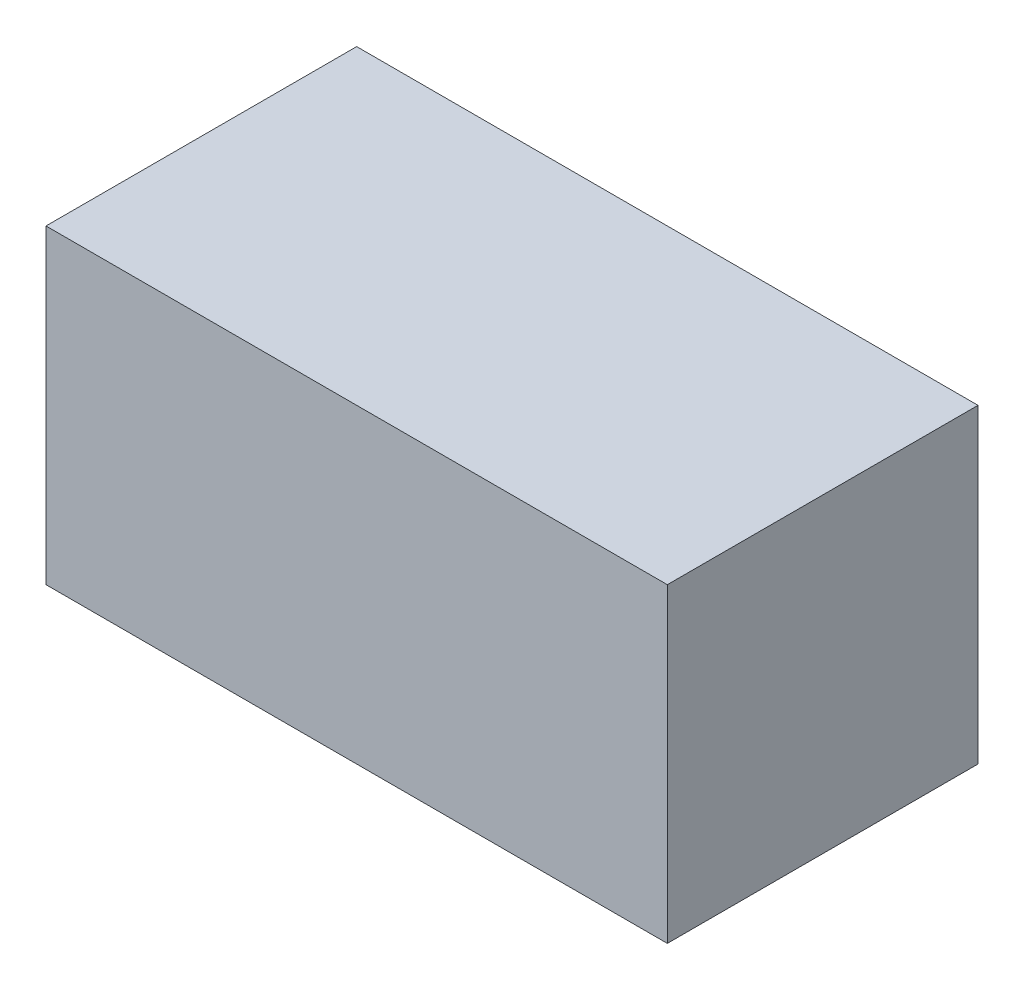
ISO-10303-21;
HEADER;
FILE_DESCRIPTION(('STEP AP214'),'2;1');
FILE_NAME('part.step','',(''),(''),'','','');
FILE_SCHEMA(('AUTOMOTIVE_DESIGN { 1 0 10303 214 1 1 1 1 }'));
ENDSEC;
DATA;
#1=APPLICATION_CONTEXT('core data for automotive mechanical design processes');
#2=APPLICATION_PROTOCOL_DEFINITION('international standard','automotive_design',2000,#1);
#3=PRODUCT_CONTEXT('',#1,'mechanical');
#4=PRODUCT('Part','Part','',(#3));
#5=PRODUCT_RELATED_PRODUCT_CATEGORY('part','',(#4));
#6=PRODUCT_DEFINITION_FORMATION('','',#4);
#7=PRODUCT_DEFINITION_CONTEXT('part definition',#1,'design');
#8=PRODUCT_DEFINITION('design','',#6,#7);
#9=PRODUCT_DEFINITION_SHAPE('','',#8);
#10=(LENGTH_UNIT() NAMED_UNIT(*) SI_UNIT(.MILLI.,.METRE.));
#11=(NAMED_UNIT(*) PLANE_ANGLE_UNIT() SI_UNIT($,.RADIAN.));
#12=(NAMED_UNIT(*) SI_UNIT($,.STERADIAN.) SOLID_ANGLE_UNIT());
#13=UNCERTAINTY_MEASURE_WITH_UNIT(LENGTH_MEASURE(1.E-05),#10,'distance_accuracy_value','');
#14=(GEOMETRIC_REPRESENTATION_CONTEXT(3) GLOBAL_UNCERTAINTY_ASSIGNED_CONTEXT((#13)) GLOBAL_UNIT_ASSIGNED_CONTEXT((#10,
#11,#12)) REPRESENTATION_CONTEXT('',''));
#15=CARTESIAN_POINT('',(0.,0.,0.));
#16=DIRECTION('',(0.,0.,1.));
#17=DIRECTION('',(1.,0.,0.));
#18=AXIS2_PLACEMENT_3D('',#15,#16,#17);
#19=CARTESIAN_POINT('',(25.,25.,12.5));
#20=DIRECTION('',(-1.,0.,0.));
#21=DIRECTION('',(0.,0.,1.));
#22=AXIS2_PLACEMENT_3D('',#19,#20,#21);
#23=PLANE('',#22);
#24=DIRECTION('',(0.,0.,-1.));
#25=VECTOR('',#24,1.);
#26=CARTESIAN_POINT('',(25.,0.,12.5));
#27=LINE('',#26,#25);
#28=CARTESIAN_POINT('',(25.,0.,12.5));
#29=VERTEX_POINT('',#28);
#30=CARTESIAN_POINT('',(25.,0.,-12.5));
#31=VERTEX_POINT('',#30);
#32=EDGE_CURVE('E105',#29,#31,#27,.T.);
#33=ORIENTED_EDGE('',*,*,#32,.T.);
#34=DIRECTION('',(0.,-1.,0.));
#35=VECTOR('',#34,1.);
#36=CARTESIAN_POINT('',(25.,25.,-12.5));
#37=LINE('',#36,#35);
#38=CARTESIAN_POINT('',(25.,25.,-12.5));
#39=VERTEX_POINT('',#38);
#40=EDGE_CURVE('E11',#39,#31,#37,.T.);
#41=ORIENTED_EDGE('',*,*,#40,.F.);
#42=DIRECTION('',(0.,0.,-1.));
#43=VECTOR('',#42,1.);
#44=CARTESIAN_POINT('',(25.,25.,12.5));
#45=LINE('',#44,#43);
#46=CARTESIAN_POINT('',(25.,25.,12.5));
#47=VERTEX_POINT('',#46);
#48=EDGE_CURVE('E89',#47,#39,#45,.T.);
#49=ORIENTED_EDGE('',*,*,#48,.F.);
#50=DIRECTION('',(0.,-1.,0.));
#51=VECTOR('',#50,1.);
#52=CARTESIAN_POINT('',(25.,25.,12.5));
#53=LINE('',#52,#51);
#54=EDGE_CURVE('E97',#47,#29,#53,.T.);
#55=ORIENTED_EDGE('',*,*,#54,.T.);
#56=EDGE_LOOP('',(#33,#41,#49,#55));
#57=FACE_BOUND('',#56,.T.);
#58=ADVANCED_FACE('F39',(#57),#23,.F.);
#59=CARTESIAN_POINT('',(-25.,25.,-12.5));
#60=DIRECTION('',(0.,0.,1.));
#61=DIRECTION('',(1.,0.,0.));
#62=AXIS2_PLACEMENT_3D('',#59,#60,#61);
#63=PLANE('',#62);
#64=DIRECTION('',(-1.,0.,0.));
#65=VECTOR('',#64,1.);
#66=CARTESIAN_POINT('',(-25.,0.,-12.5));
#67=LINE('',#66,#65);
#68=CARTESIAN_POINT('',(-25.,0.,-12.5));
#69=VERTEX_POINT('',#68);
#70=EDGE_CURVE('E92',#31,#69,#67,.T.);
#71=ORIENTED_EDGE('',*,*,#70,.T.);
#72=DIRECTION('',(0.,-1.,0.));
#73=VECTOR('',#72,1.);
#74=CARTESIAN_POINT('',(-25.,25.,-12.5));
#75=LINE('',#74,#73);
#76=CARTESIAN_POINT('',(-25.,25.,-12.5));
#77=VERTEX_POINT('',#76);
#78=EDGE_CURVE('E50',#77,#69,#75,.T.);
#79=ORIENTED_EDGE('',*,*,#78,.F.);
#80=DIRECTION('',(-1.,0.,0.));
#81=VECTOR('',#80,1.);
#82=CARTESIAN_POINT('',(-25.,25.,-12.5));
#83=LINE('',#82,#81);
#84=EDGE_CURVE('E82',#39,#77,#83,.T.);
#85=ORIENTED_EDGE('',*,*,#84,.F.);
#86=ORIENTED_EDGE('',*,*,#40,.T.);
#87=EDGE_LOOP('',(#71,#79,#85,#86));
#88=FACE_BOUND('',#87,.T.);
#89=ADVANCED_FACE('F93',(#88),#63,.F.);
#90=CARTESIAN_POINT('',(-25.,25.,12.5));
#91=DIRECTION('',(1.,0.,0.));
#92=DIRECTION('',(0.,0.,-1.));
#93=AXIS2_PLACEMENT_3D('',#90,#91,#92);
#94=PLANE('',#93);
#95=DIRECTION('',(0.,0.,1.));
#96=VECTOR('',#95,1.);
#97=CARTESIAN_POINT('',(-25.,0.,12.5));
#98=LINE('',#97,#96);
#99=CARTESIAN_POINT('',(-25.,0.,12.5));
#100=VERTEX_POINT('',#99);
#101=EDGE_CURVE('E72',#69,#100,#98,.T.);
#102=ORIENTED_EDGE('',*,*,#101,.T.);
#103=DIRECTION('',(0.,-1.,0.));
#104=VECTOR('',#103,1.);
#105=CARTESIAN_POINT('',(-25.,25.,12.5));
#106=LINE('',#105,#104);
#107=CARTESIAN_POINT('',(-25.,25.,12.5));
#108=VERTEX_POINT('',#107);
#109=EDGE_CURVE('E94',#108,#100,#106,.T.);
#110=ORIENTED_EDGE('',*,*,#109,.F.);
#111=DIRECTION('',(0.,0.,1.));
#112=VECTOR('',#111,1.);
#113=CARTESIAN_POINT('',(-25.,25.,12.5));
#114=LINE('',#113,#112);
#115=EDGE_CURVE('E88',#77,#108,#114,.T.);
#116=ORIENTED_EDGE('',*,*,#115,.F.);
#117=ORIENTED_EDGE('',*,*,#78,.T.);
#118=EDGE_LOOP('',(#102,#110,#116,#117));
#119=FACE_BOUND('',#118,.T.);
#120=ADVANCED_FACE('F96',(#119),#94,.F.);
#121=CARTESIAN_POINT('',(-25.,25.,12.5));
#122=DIRECTION('',(0.,0.,-1.));
#123=DIRECTION('',(-1.,0.,0.));
#124=AXIS2_PLACEMENT_3D('',#121,#122,#123);
#125=PLANE('',#124);
#126=DIRECTION('',(1.,0.,0.));
#127=VECTOR('',#126,1.);
#128=CARTESIAN_POINT('',(-25.,0.,12.5));
#129=LINE('',#128,#127);
#130=EDGE_CURVE('E76',#100,#29,#129,.T.);
#131=ORIENTED_EDGE('',*,*,#130,.T.);
#132=ORIENTED_EDGE('',*,*,#54,.F.);
#133=DIRECTION('',(1.,0.,0.));
#134=VECTOR('',#133,1.);
#135=CARTESIAN_POINT('',(-25.,25.,12.5));
#136=LINE('',#135,#134);
#137=EDGE_CURVE('E54',#108,#47,#136,.T.);
#138=ORIENTED_EDGE('',*,*,#137,.F.);
#139=ORIENTED_EDGE('',*,*,#109,.T.);
#140=EDGE_LOOP('',(#131,#132,#138,#139));
#141=FACE_BOUND('',#140,.T.);
#142=ADVANCED_FACE('F108',(#141),#125,.F.);
#143=CARTESIAN_POINT('',(0.,25.,0.));
#144=DIRECTION('',(0.,-1.,0.));
#145=DIRECTION('',(0.,0.,-1.));
#146=AXIS2_PLACEMENT_3D('',#143,#144,#145);
#147=PLANE('',#146);
#148=ORIENTED_EDGE('',*,*,#48,.T.);
#149=ORIENTED_EDGE('',*,*,#84,.T.);
#150=ORIENTED_EDGE('',*,*,#115,.T.);
#151=ORIENTED_EDGE('',*,*,#137,.T.);
#152=EDGE_LOOP('',(#148,#149,#150,#151));
#153=FACE_BOUND('',#152,.T.);
#154=ADVANCED_FACE('F86',(#153),#147,.F.);
#155=CARTESIAN_POINT('',(0.,0.,0.));
#156=DIRECTION('',(0.,-1.,0.));
#157=DIRECTION('',(0.,0.,-1.));
#158=AXIS2_PLACEMENT_3D('',#155,#156,#157);
#159=PLANE('',#158);
#160=ORIENTED_EDGE('',*,*,#32,.F.);
#161=ORIENTED_EDGE('',*,*,#130,.F.);
#162=ORIENTED_EDGE('',*,*,#101,.F.);
#163=ORIENTED_EDGE('',*,*,#70,.F.);
#164=EDGE_LOOP('',(#160,#161,#162,#163));
#165=FACE_BOUND('',#164,.T.);
#166=ADVANCED_FACE('F115',(#165),#159,.T.);
#167=CLOSED_SHELL('',(#58,#89,#120,#142,#154,#166));
#168=MANIFOLD_SOLID_BREP('B2',#167);
#169=ADVANCED_BREP_SHAPE_REPRESENTATION('',(#18,#168),#14);
#170=SHAPE_DEFINITION_REPRESENTATION(#9,#169);
ENDSEC;
END-ISO-10303-21;
